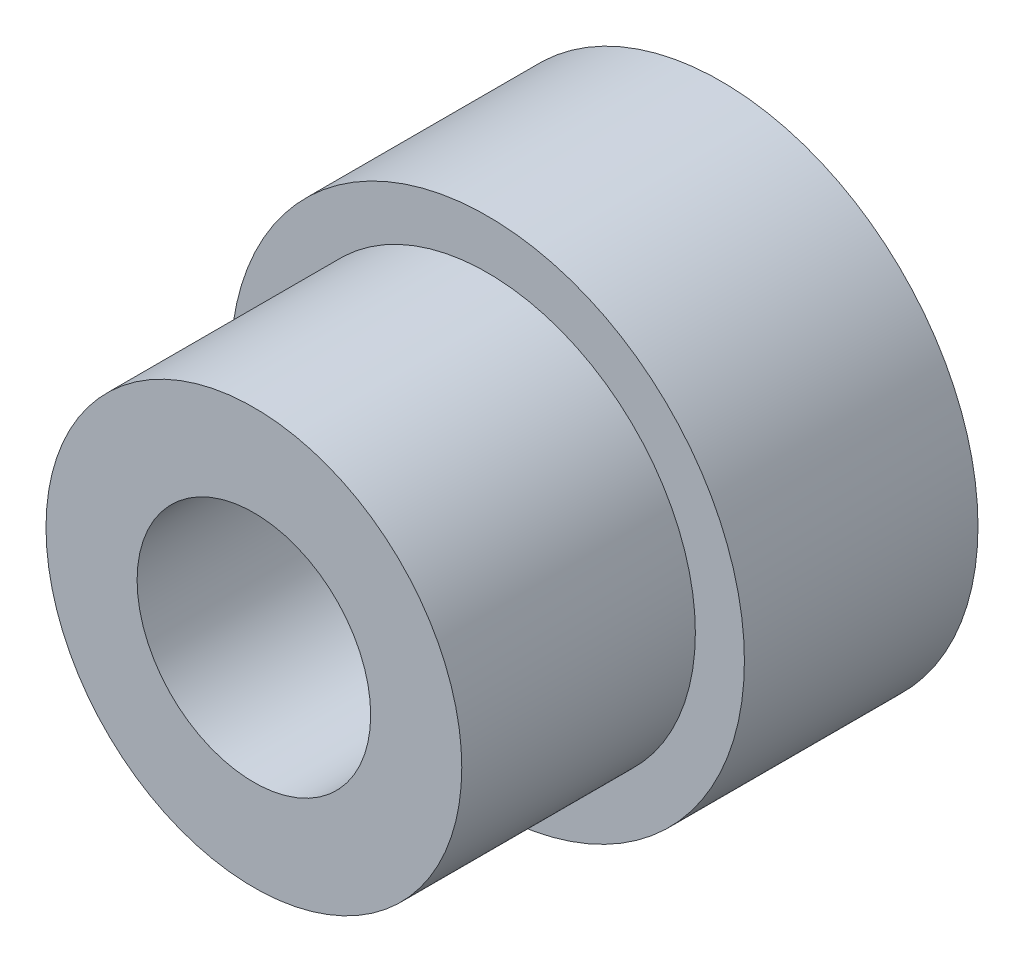
ISO-10303-21;
HEADER;
FILE_DESCRIPTION(('STEP AP214'),'2;1');
FILE_NAME('part.step','',(''),(''),'','','');
FILE_SCHEMA(('AUTOMOTIVE_DESIGN { 1 0 10303 214 1 1 1 1 }'));
ENDSEC;
DATA;
#1=APPLICATION_CONTEXT('core data for automotive mechanical design processes');
#2=APPLICATION_PROTOCOL_DEFINITION('international standard','automotive_design',2000,#1);
#3=PRODUCT_CONTEXT('',#1,'mechanical');
#4=PRODUCT('Part','Part','',(#3));
#5=PRODUCT_RELATED_PRODUCT_CATEGORY('part','',(#4));
#6=PRODUCT_DEFINITION_FORMATION('','',#4);
#7=PRODUCT_DEFINITION_CONTEXT('part definition',#1,'design');
#8=PRODUCT_DEFINITION('design','',#6,#7);
#9=PRODUCT_DEFINITION_SHAPE('','',#8);
#10=(LENGTH_UNIT() NAMED_UNIT(*) SI_UNIT(.MILLI.,.METRE.));
#11=(NAMED_UNIT(*) PLANE_ANGLE_UNIT() SI_UNIT($,.RADIAN.));
#12=(NAMED_UNIT(*) SI_UNIT($,.STERADIAN.) SOLID_ANGLE_UNIT());
#13=UNCERTAINTY_MEASURE_WITH_UNIT(LENGTH_MEASURE(1.E-05),#10,'distance_accuracy_value','');
#14=(GEOMETRIC_REPRESENTATION_CONTEXT(3) GLOBAL_UNCERTAINTY_ASSIGNED_CONTEXT((#13)) GLOBAL_UNIT_ASSIGNED_CONTEXT((#10,
#11,#12)) REPRESENTATION_CONTEXT('',''));
#15=CARTESIAN_POINT('',(0.,0.,0.));
#16=DIRECTION('',(0.,0.,1.));
#17=DIRECTION('',(1.,0.,0.));
#18=AXIS2_PLACEMENT_3D('',#15,#16,#17);
#19=CARTESIAN_POINT('',(0.,0.,5.));
#20=DIRECTION('',(0.,0.,-1.));
#21=DIRECTION('',(-1.,0.,0.));
#22=AXIS2_PLACEMENT_3D('',#19,#20,#21);
#23=CYLINDRICAL_SURFACE('',#22,5.5);
#24=CARTESIAN_POINT('',(0.,0.,5.));
#25=DIRECTION('',(0.,0.,1.));
#26=DIRECTION('',(1.,0.,0.));
#27=AXIS2_PLACEMENT_3D('',#24,#25,#26);
#28=CIRCLE('',#27,5.5);
#29=CARTESIAN_POINT('',(5.5,0.,5.));
#30=VERTEX_POINT('',#29);
#31=EDGE_CURVE('E44',#30,#30,#28,.T.);
#32=ORIENTED_EDGE('',*,*,#31,.F.);
#33=EDGE_LOOP('',(#32));
#34=FACE_BOUND('',#33,.T.);
#35=CARTESIAN_POINT('',(0.,0.,0.));
#36=DIRECTION('',(0.,0.,1.));
#37=DIRECTION('',(1.,0.,0.));
#38=AXIS2_PLACEMENT_3D('',#35,#36,#37);
#39=CIRCLE('',#38,5.5);
#40=CARTESIAN_POINT('',(5.5,0.,0.));
#41=VERTEX_POINT('',#40);
#42=EDGE_CURVE('E40',#41,#41,#39,.T.);
#43=ORIENTED_EDGE('',*,*,#42,.T.);
#44=EDGE_LOOP('',(#43));
#45=FACE_BOUND('',#44,.T.);
#46=ADVANCED_FACE('F37',(#34,#45),#23,.T.);
#47=CARTESIAN_POINT('',(0.,0.,5.));
#48=DIRECTION('',(0.,0.,1.));
#49=DIRECTION('',(1.,0.,0.));
#50=AXIS2_PLACEMENT_3D('',#47,#48,#49);
#51=PLANE('',#50);
#52=CARTESIAN_POINT('',(0.,0.,5.));
#53=DIRECTION('',(0.,0.,1.));
#54=DIRECTION('',(1.,0.,0.));
#55=AXIS2_PLACEMENT_3D('',#52,#53,#54);
#56=CIRCLE('',#55,4.45);
#57=CARTESIAN_POINT('',(4.45,0.,5.));
#58=VERTEX_POINT('',#57);
#59=EDGE_CURVE('E10',#58,#58,#56,.T.);
#60=ORIENTED_EDGE('',*,*,#59,.F.);
#61=EDGE_LOOP('',(#60));
#62=FACE_BOUND('',#61,.T.);
#63=ORIENTED_EDGE('',*,*,#31,.T.);
#64=EDGE_LOOP('',(#63));
#65=FACE_BOUND('',#64,.T.);
#66=ADVANCED_FACE('F81',(#62,#65),#51,.T.);
#67=CARTESIAN_POINT('',(0.,0.,0.));
#68=DIRECTION('',(0.,0.,1.));
#69=DIRECTION('',(1.,0.,0.));
#70=AXIS2_PLACEMENT_3D('',#67,#68,#69);
#71=PLANE('',#70);
#72=CARTESIAN_POINT('',(0.,0.,0.));
#73=DIRECTION('',(0.,0.,1.));
#74=DIRECTION('',(1.,0.,0.));
#75=AXIS2_PLACEMENT_3D('',#72,#73,#74);
#76=CIRCLE('',#75,2.5);
#77=CARTESIAN_POINT('',(2.5,0.,0.));
#78=VERTEX_POINT('',#77);
#79=EDGE_CURVE('E53',#78,#78,#76,.T.);
#80=ORIENTED_EDGE('',*,*,#79,.T.);
#81=EDGE_LOOP('',(#80));
#82=FACE_BOUND('',#81,.T.);
#83=ORIENTED_EDGE('',*,*,#42,.F.);
#84=EDGE_LOOP('',(#83));
#85=FACE_BOUND('',#84,.T.);
#86=ADVANCED_FACE('F60',(#82,#85),#71,.F.);
#87=CARTESIAN_POINT('',(0.,0.,10.));
#88=DIRECTION('',(0.,0.,-1.));
#89=DIRECTION('',(-1.,0.,0.));
#90=AXIS2_PLACEMENT_3D('',#87,#88,#89);
#91=CYLINDRICAL_SURFACE('',#90,4.45);
#92=CARTESIAN_POINT('',(0.,0.,10.));
#93=DIRECTION('',(0.,0.,1.));
#94=DIRECTION('',(1.,0.,0.));
#95=AXIS2_PLACEMENT_3D('',#92,#93,#94);
#96=CIRCLE('',#95,4.45);
#97=CARTESIAN_POINT('',(4.45,0.,10.));
#98=VERTEX_POINT('',#97);
#99=EDGE_CURVE('E50',#98,#98,#96,.T.);
#100=ORIENTED_EDGE('',*,*,#99,.F.);
#101=EDGE_LOOP('',(#100));
#102=FACE_BOUND('',#101,.T.);
#103=ORIENTED_EDGE('',*,*,#59,.T.);
#104=EDGE_LOOP('',(#103));
#105=FACE_BOUND('',#104,.T.);
#106=ADVANCED_FACE('F72',(#102,#105),#91,.T.);
#107=CARTESIAN_POINT('',(0.,0.,10.));
#108=DIRECTION('',(0.,0.,1.));
#109=DIRECTION('',(1.,0.,0.));
#110=AXIS2_PLACEMENT_3D('',#107,#108,#109);
#111=PLANE('',#110);
#112=CARTESIAN_POINT('',(0.,0.,10.));
#113=DIRECTION('',(0.,0.,1.));
#114=DIRECTION('',(1.,0.,0.));
#115=AXIS2_PLACEMENT_3D('',#112,#113,#114);
#116=CIRCLE('',#115,2.5);
#117=CARTESIAN_POINT('',(2.5,0.,10.));
#118=VERTEX_POINT('',#117);
#119=EDGE_CURVE('E54',#118,#118,#116,.T.);
#120=ORIENTED_EDGE('',*,*,#119,.F.);
#121=EDGE_LOOP('',(#120));
#122=FACE_BOUND('',#121,.T.);
#123=ORIENTED_EDGE('',*,*,#99,.T.);
#124=EDGE_LOOP('',(#123));
#125=FACE_BOUND('',#124,.T.);
#126=ADVANCED_FACE('F66',(#122,#125),#111,.T.);
#127=CARTESIAN_POINT('',(0.,0.,0.));
#128=DIRECTION('',(0.,0.,1.));
#129=DIRECTION('',(1.,0.,0.));
#130=AXIS2_PLACEMENT_3D('',#127,#128,#129);
#131=CYLINDRICAL_SURFACE('',#130,2.5);
#132=ORIENTED_EDGE('',*,*,#79,.F.);
#133=EDGE_LOOP('',(#132));
#134=FACE_BOUND('',#133,.T.);
#135=ORIENTED_EDGE('',*,*,#119,.T.);
#136=EDGE_LOOP('',(#135));
#137=FACE_BOUND('',#136,.T.);
#138=ADVANCED_FACE('F63',(#134,#137),#131,.F.);
#139=CLOSED_SHELL('',(#46,#66,#86,#106,#126,#138));
#140=MANIFOLD_SOLID_BREP('B2',#139);
#141=ADVANCED_BREP_SHAPE_REPRESENTATION('',(#18,#140),#14);
#142=SHAPE_DEFINITION_REPRESENTATION(#9,#141);
ENDSEC;
END-ISO-10303-21;
